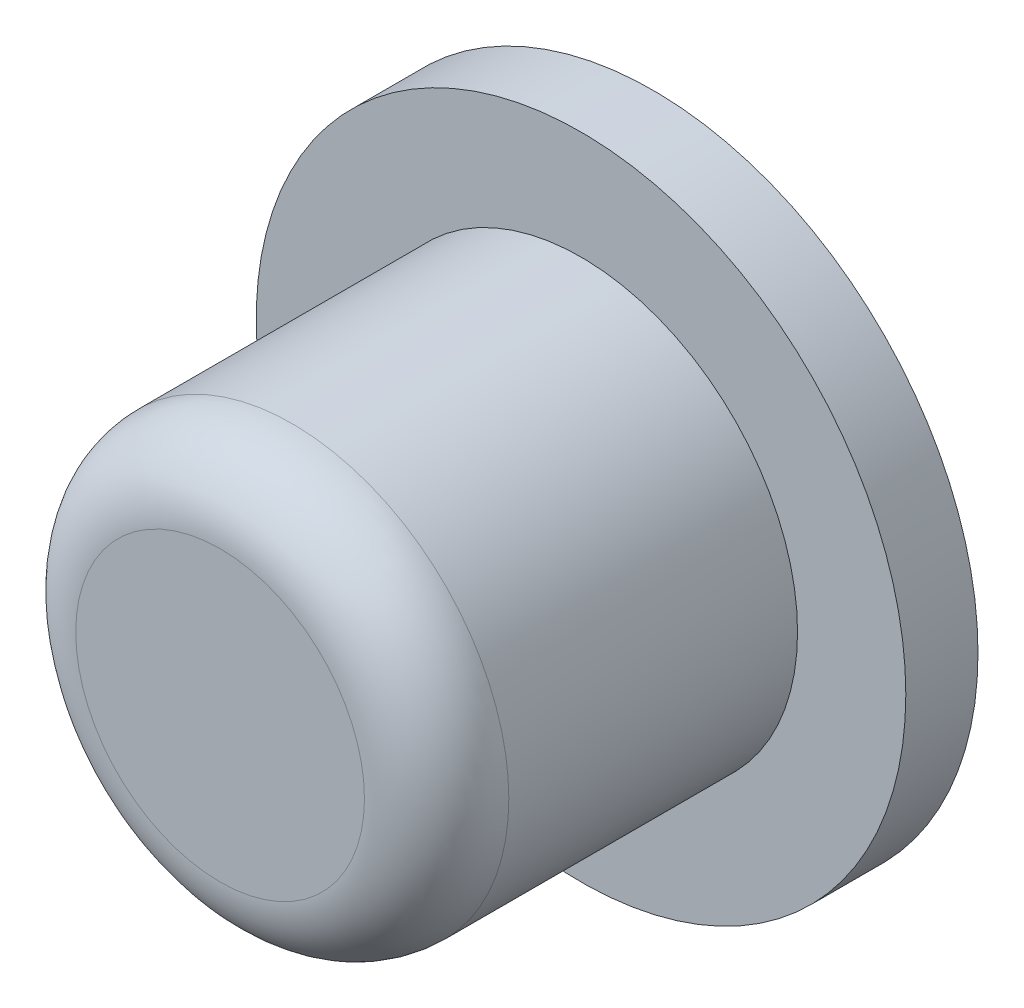
ISO-10303-21;
HEADER;
FILE_DESCRIPTION(('STEP AP214'),'2;1');
FILE_NAME('part.step','',(''),(''),'','','');
FILE_SCHEMA(('AUTOMOTIVE_DESIGN { 1 0 10303 214 1 1 1 1 }'));
ENDSEC;
DATA;
#1=APPLICATION_CONTEXT('core data for automotive mechanical design processes');
#2=APPLICATION_PROTOCOL_DEFINITION('international standard','automotive_design',2000,#1);
#3=PRODUCT_CONTEXT('',#1,'mechanical');
#4=PRODUCT('Part','Part','',(#3));
#5=PRODUCT_RELATED_PRODUCT_CATEGORY('part','',(#4));
#6=PRODUCT_DEFINITION_FORMATION('','',#4);
#7=PRODUCT_DEFINITION_CONTEXT('part definition',#1,'design');
#8=PRODUCT_DEFINITION('design','',#6,#7);
#9=PRODUCT_DEFINITION_SHAPE('','',#8);
#10=(LENGTH_UNIT() NAMED_UNIT(*) SI_UNIT(.MILLI.,.METRE.));
#11=(NAMED_UNIT(*) PLANE_ANGLE_UNIT() SI_UNIT($,.RADIAN.));
#12=(NAMED_UNIT(*) SI_UNIT($,.STERADIAN.) SOLID_ANGLE_UNIT());
#13=UNCERTAINTY_MEASURE_WITH_UNIT(LENGTH_MEASURE(1.E-05),#10,'distance_accuracy_value','');
#14=(GEOMETRIC_REPRESENTATION_CONTEXT(3) GLOBAL_UNCERTAINTY_ASSIGNED_CONTEXT((#13)) GLOBAL_UNIT_ASSIGNED_CONTEXT((#10,
#11,#12)) REPRESENTATION_CONTEXT('',''));
#15=CARTESIAN_POINT('',(0.,0.,0.));
#16=DIRECTION('',(0.,0.,1.));
#17=DIRECTION('',(1.,0.,0.));
#18=AXIS2_PLACEMENT_3D('',#15,#16,#17);
#19=CARTESIAN_POINT('',(0.,0.,0.));
#20=DIRECTION('',(0.,0.,1.));
#21=DIRECTION('',(1.,0.,0.));
#22=AXIS2_PLACEMENT_3D('',#19,#20,#21);
#23=PLANE('',#22);
#24=CARTESIAN_POINT('',(0.,0.,0.));
#25=DIRECTION('',(0.,0.,1.));
#26=DIRECTION('',(1.,0.,0.));
#27=AXIS2_PLACEMENT_3D('',#24,#25,#26);
#28=CIRCLE('',#27,1.9);
#29=CARTESIAN_POINT('',(1.9,0.,0.));
#30=VERTEX_POINT('',#29);
#31=EDGE_CURVE('E60',#30,#30,#28,.T.);
#32=ORIENTED_EDGE('',*,*,#31,.T.);
#33=EDGE_LOOP('',(#32));
#34=FACE_BOUND('',#33,.T.);
#35=CARTESIAN_POINT('',(0.,0.,0.));
#36=DIRECTION('',(0.,0.,1.));
#37=DIRECTION('',(1.,0.,0.));
#38=AXIS2_PLACEMENT_3D('',#35,#36,#37);
#39=CIRCLE('',#38,4.5);
#40=CARTESIAN_POINT('',(4.5,0.,0.));
#41=VERTEX_POINT('',#40);
#42=EDGE_CURVE('E66',#41,#41,#39,.T.);
#43=ORIENTED_EDGE('',*,*,#42,.F.);
#44=EDGE_LOOP('',(#43));
#45=FACE_BOUND('',#44,.T.);
#46=ADVANCED_FACE('F45',(#34,#45),#23,.F.);
#47=CARTESIAN_POINT('',(0.,0.,2.));
#48=DIRECTION('',(0.,0.,-1.));
#49=DIRECTION('',(-1.,0.,0.));
#50=AXIS2_PLACEMENT_3D('',#47,#48,#49);
#51=CYLINDRICAL_SURFACE('',#50,1.9);
#52=CARTESIAN_POINT('',(0.,0.,2.));
#53=DIRECTION('',(0.,0.,1.));
#54=DIRECTION('',(1.,0.,0.));
#55=AXIS2_PLACEMENT_3D('',#52,#53,#54);
#56=CIRCLE('',#55,1.9);
#57=CARTESIAN_POINT('',(1.9,0.,2.));
#58=VERTEX_POINT('',#57);
#59=EDGE_CURVE('E56',#58,#58,#56,.T.);
#60=ORIENTED_EDGE('',*,*,#59,.T.);
#61=EDGE_LOOP('',(#60));
#62=FACE_BOUND('',#61,.T.);
#63=ORIENTED_EDGE('',*,*,#31,.F.);
#64=EDGE_LOOP('',(#63));
#65=FACE_BOUND('',#64,.T.);
#66=ADVANCED_FACE('F90',(#62,#65),#51,.F.);
#67=CARTESIAN_POINT('',(0.,0.,2.));
#68=DIRECTION('',(0.,0.,1.));
#69=DIRECTION('',(1.,0.,0.));
#70=AXIS2_PLACEMENT_3D('',#67,#68,#69);
#71=PLANE('',#70);
#72=ORIENTED_EDGE('',*,*,#59,.F.);
#73=EDGE_LOOP('',(#72));
#74=FACE_BOUND('',#73,.T.);
#75=ADVANCED_FACE('F80',(#74),#71,.F.);
#76=CARTESIAN_POINT('',(0.,0.,1.));
#77=DIRECTION('',(0.,0.,1.));
#78=DIRECTION('',(1.,0.,0.));
#79=AXIS2_PLACEMENT_3D('',#76,#77,#78);
#80=PLANE('',#79);
#81=CARTESIAN_POINT('',(0.,0.,1.));
#82=DIRECTION('',(0.,0.,1.));
#83=DIRECTION('',(1.,0.,0.));
#84=AXIS2_PLACEMENT_3D('',#81,#82,#83);
#85=CIRCLE('',#84,4.5);
#86=CARTESIAN_POINT('',(4.5,0.,1.));
#87=VERTEX_POINT('',#86);
#88=EDGE_CURVE('E64',#87,#87,#85,.T.);
#89=ORIENTED_EDGE('',*,*,#88,.T.);
#90=EDGE_LOOP('',(#89));
#91=FACE_BOUND('',#90,.T.);
#92=CARTESIAN_POINT('',(0.,0.,1.));
#93=DIRECTION('',(0.,0.,1.));
#94=DIRECTION('',(1.,0.,0.));
#95=AXIS2_PLACEMENT_3D('',#92,#93,#94);
#96=CIRCLE('',#95,3.);
#97=CARTESIAN_POINT('',(3.,0.,1.));
#98=VERTEX_POINT('',#97);
#99=EDGE_CURVE('E69',#98,#98,#96,.T.);
#100=ORIENTED_EDGE('',*,*,#99,.F.);
#101=EDGE_LOOP('',(#100));
#102=FACE_BOUND('',#101,.T.);
#103=ADVANCED_FACE('F77',(#91,#102),#80,.T.);
#104=CARTESIAN_POINT('',(0.,0.,1.));
#105=DIRECTION('',(0.,0.,-1.));
#106=DIRECTION('',(-1.,0.,0.));
#107=AXIS2_PLACEMENT_3D('',#104,#105,#106);
#108=CYLINDRICAL_SURFACE('',#107,4.5);
#109=ORIENTED_EDGE('',*,*,#88,.F.);
#110=EDGE_LOOP('',(#109));
#111=FACE_BOUND('',#110,.T.);
#112=ORIENTED_EDGE('',*,*,#42,.T.);
#113=EDGE_LOOP('',(#112));
#114=FACE_BOUND('',#113,.T.);
#115=ADVANCED_FACE('F79',(#111,#114),#108,.T.);
#116=CARTESIAN_POINT('',(0.,0.,6.));
#117=DIRECTION('',(0.,0.,1.));
#118=DIRECTION('',(1.,0.,0.));
#119=AXIS2_PLACEMENT_3D('',#116,#117,#118);
#120=PLANE('',#119);
#121=CARTESIAN_POINT('',(0.,0.,6.));
#122=DIRECTION('',(0.,0.,1.));
#123=DIRECTION('',(1.,0.,0.));
#124=AXIS2_PLACEMENT_3D('',#121,#122,#123);
#125=CIRCLE('',#124,2.);
#126=CARTESIAN_POINT('',(2.,0.,6.));
#127=VERTEX_POINT('',#126);
#128=EDGE_CURVE('E52',#127,#127,#125,.T.);
#129=ORIENTED_EDGE('',*,*,#128,.T.);
#130=EDGE_LOOP('',(#129));
#131=FACE_BOUND('',#130,.T.);
#132=ADVANCED_FACE('F87',(#131),#120,.T.);
#133=CARTESIAN_POINT('',(0.,0.,6.));
#134=DIRECTION('',(0.,0.,-1.));
#135=DIRECTION('',(-1.,0.,0.));
#136=AXIS2_PLACEMENT_3D('',#133,#134,#135);
#137=CYLINDRICAL_SURFACE('',#136,3.);
#138=CARTESIAN_POINT('',(0.,0.,5.));
#139=DIRECTION('',(0.,0.,1.));
#140=DIRECTION('',(1.,0.,0.));
#141=AXIS2_PLACEMENT_3D('',#138,#139,#140);
#142=CIRCLE('',#141,3.);
#143=CARTESIAN_POINT('',(3.,0.,5.));
#144=VERTEX_POINT('',#143);
#145=EDGE_CURVE('E11',#144,#144,#142,.F.);
#146=ORIENTED_EDGE('',*,*,#145,.T.);
#147=EDGE_LOOP('',(#146));
#148=FACE_BOUND('',#147,.T.);
#149=ORIENTED_EDGE('',*,*,#99,.T.);
#150=EDGE_LOOP('',(#149));
#151=FACE_BOUND('',#150,.T.);
#152=ADVANCED_FACE('F75',(#148,#151),#137,.T.);
#153=CARTESIAN_POINT('',(0.,0.,5.));
#154=DIRECTION('',(0.,0.,1.));
#155=DIRECTION('',(1.,0.,0.));
#156=AXIS2_PLACEMENT_3D('',#153,#154,#155);
#157=TOROIDAL_SURFACE('',#156,2.,1.);
#158=ORIENTED_EDGE('',*,*,#145,.F.);
#159=EDGE_LOOP('',(#158));
#160=FACE_BOUND('',#159,.T.);
#161=ORIENTED_EDGE('',*,*,#128,.F.);
#162=EDGE_LOOP('',(#161));
#163=FACE_BOUND('',#162,.T.);
#164=ADVANCED_FACE('F47',(#160,#163),#157,.T.);
#165=CLOSED_SHELL('',(#46,#66,#75,#103,#115,#132,#152,#164));
#166=MANIFOLD_SOLID_BREP('B2',#165);
#167=ADVANCED_BREP_SHAPE_REPRESENTATION('',(#18,#166),#14);
#168=SHAPE_DEFINITION_REPRESENTATION(#9,#167);
ENDSEC;
END-ISO-10303-21;
